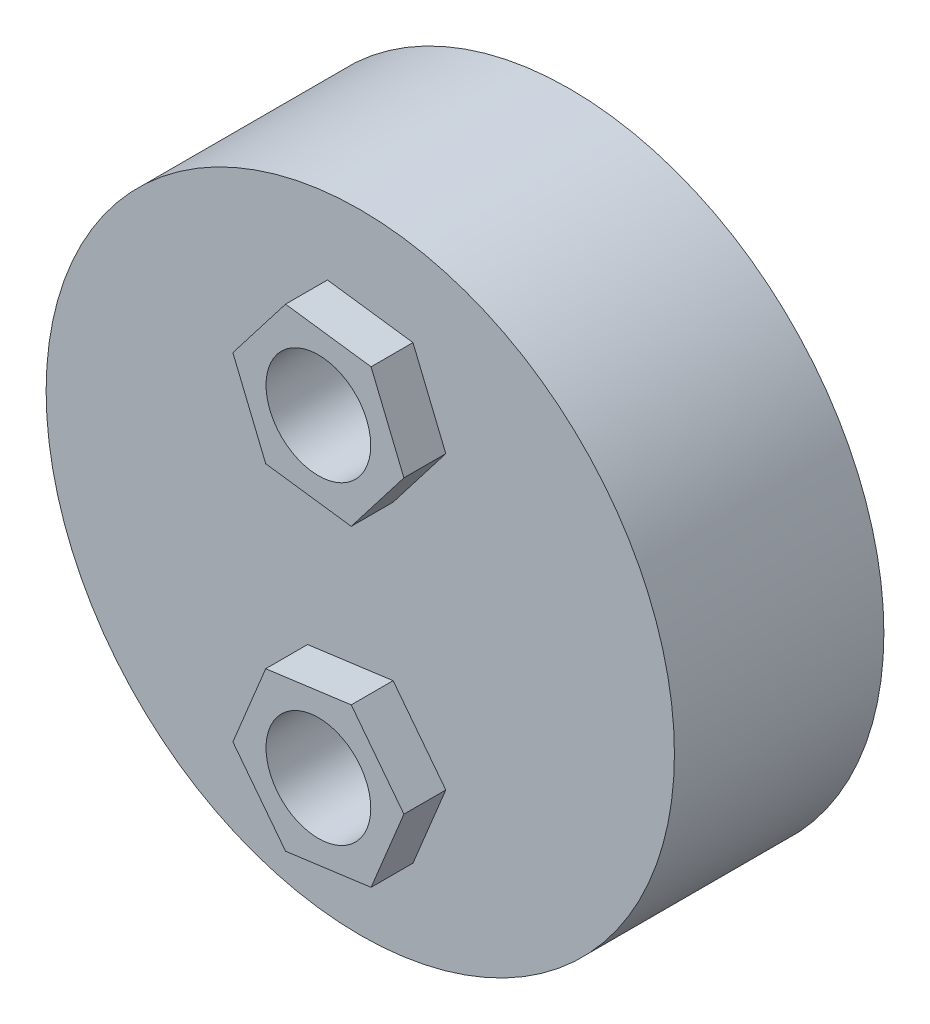
ISO-10303-21;
HEADER;
FILE_DESCRIPTION(('STEP AP214'),'2;1');
FILE_NAME('part.step','',(''),(''),'','','');
FILE_SCHEMA(('AUTOMOTIVE_DESIGN { 1 0 10303 214 1 1 1 1 }'));
ENDSEC;
DATA;
#1=APPLICATION_CONTEXT('core data for automotive mechanical design processes');
#2=APPLICATION_PROTOCOL_DEFINITION('international standard','automotive_design',2000,#1);
#3=PRODUCT_CONTEXT('',#1,'mechanical');
#4=PRODUCT('Part','Part','',(#3));
#5=PRODUCT_RELATED_PRODUCT_CATEGORY('part','',(#4));
#6=PRODUCT_DEFINITION_FORMATION('','',#4);
#7=PRODUCT_DEFINITION_CONTEXT('part definition',#1,'design');
#8=PRODUCT_DEFINITION('design','',#6,#7);
#9=PRODUCT_DEFINITION_SHAPE('','',#8);
#10=(LENGTH_UNIT() NAMED_UNIT(*) SI_UNIT(.MILLI.,.METRE.));
#11=(NAMED_UNIT(*) PLANE_ANGLE_UNIT() SI_UNIT($,.RADIAN.));
#12=(NAMED_UNIT(*) SI_UNIT($,.STERADIAN.) SOLID_ANGLE_UNIT());
#13=UNCERTAINTY_MEASURE_WITH_UNIT(LENGTH_MEASURE(1.E-05),#10,'distance_accuracy_value','');
#14=(GEOMETRIC_REPRESENTATION_CONTEXT(3) GLOBAL_UNCERTAINTY_ASSIGNED_CONTEXT((#13)) GLOBAL_UNIT_ASSIGNED_CONTEXT((#10,
#11,#12)) REPRESENTATION_CONTEXT('',''));
#15=CARTESIAN_POINT('',(0.,0.,0.));
#16=DIRECTION('',(0.,0.,1.));
#17=DIRECTION('',(1.,0.,0.));
#18=AXIS2_PLACEMENT_3D('',#15,#16,#17);
#19=CARTESIAN_POINT('',(0.,0.,10.));
#20=DIRECTION('',(0.,0.,1.));
#21=DIRECTION('',(1.,0.,0.));
#22=AXIS2_PLACEMENT_3D('',#19,#20,#21);
#23=PLANE('',#22);
#24=DIRECTION('',(0.610613766098363,-0.791928550218499,0.));
#25=VECTOR('',#24,1.);
#26=CARTESIAN_POINT('',(-0.80140583409763,-0.617921193012348,10.));
#27=LINE('',#26,#25);
#28=CARTESIAN_POINT('',(1.56758542115873,-3.69035734564447,10.));
#29=VERTEX_POINT('',#28);
#30=CARTESIAN_POINT('',(4.08304002859203,-6.95274747014782,10.));
#31=VERTEX_POINT('',#30);
#32=EDGE_CURVE('E132',#29,#31,#27,.T.);
#33=ORIENTED_EDGE('',*,*,#32,.T.);
#34=DIRECTION('',(-0.380523359422219,-0.924771308450921,0.));
#35=VECTOR('',#34,1.);
#36=CARTESIAN_POINT('',(5.93847545543036,-2.44355400032037,10.));
#37=LINE('',#36,#35);
#38=CARTESIAN_POINT('',(2.5154546074333,-10.7623901245033,10.));
#39=VERTEX_POINT('',#38);
#40=EDGE_CURVE('E148',#31,#39,#37,.T.);
#41=ORIENTED_EDGE('',*,*,#40,.T.);
#42=DIRECTION('',(-0.991137125520582,-0.132842758232422,0.));
#43=VECTOR('',#42,1.);
#44=CARTESIAN_POINT('',(1.4614250146926,-10.9036624013185,10.));
#45=LINE('',#44,#43);
#46=CARTESIAN_POINT('',(-1.56758542115873,-11.3096426543555,10.));
#47=VERTEX_POINT('',#46);
#48=EDGE_CURVE('E171',#39,#47,#45,.T.);
#49=ORIENTED_EDGE('',*,*,#48,.T.);
#50=DIRECTION('',(-0.610613766098363,0.791928550218499,0.));
#51=VECTOR('',#50,1.);
#52=CARTESIAN_POINT('',(-6.45203128384838,-4.97481637722005,10.));
#53=LINE('',#52,#51);
#54=CARTESIAN_POINT('',(-4.08304002859203,-8.04725252985218,10.));
#55=VERTEX_POINT('',#54);
#56=EDGE_CURVE('E169',#47,#55,#53,.T.);
#57=ORIENTED_EDGE('',*,*,#56,.T.);
#58=DIRECTION('',(0.380523359422219,0.924771308450921,0.));
#59=VECTOR('',#58,1.);
#60=CARTESIAN_POINT('',(-0.660019180594972,0.271583594330801,10.));
#61=LINE('',#60,#59);
#62=CARTESIAN_POINT('',(-2.5154546074333,-4.23760987549665,10.));
#63=VERTEX_POINT('',#62);
#64=EDGE_CURVE('E58',#55,#63,#61,.T.);
#65=ORIENTED_EDGE('',*,*,#64,.T.);
#66=DIRECTION('',(0.991137125520582,0.132842758232423,0.));
#67=VECTOR('',#66,1.);
#68=CARTESIAN_POINT('',(0.513555828418029,-3.83162962245958,10.));
#69=LINE('',#68,#67);
#70=EDGE_CURVE('E53',#63,#29,#69,.T.);
#71=ORIENTED_EDGE('',*,*,#70,.T.);
#72=EDGE_LOOP('',(#33,#41,#49,#57,#65,#71));
#73=FACE_BOUND('',#72,.T.);
#74=CARTESIAN_POINT('',(0.,0.,10.));
#75=DIRECTION('',(0.,0.,1.));
#76=DIRECTION('',(1.,0.,0.));
#77=AXIS2_PLACEMENT_3D('',#74,#75,#76);
#78=CIRCLE('',#77,15.);
#79=CARTESIAN_POINT('',(15.,0.,10.));
#80=VERTEX_POINT('',#79);
#81=EDGE_CURVE('E11',#80,#80,#78,.T.);
#82=ORIENTED_EDGE('',*,*,#81,.T.);
#83=EDGE_LOOP('',(#82));
#84=FACE_BOUND('',#83,.T.);
#85=DIRECTION('',(0.991137125520582,-0.132842758232423,0.));
#86=VECTOR('',#85,1.);
#87=CARTESIAN_POINT('',(0.513555828418029,3.83162962245958,10.));
#88=LINE('',#87,#86);
#89=CARTESIAN_POINT('',(-2.5154546074333,4.23760987549665,10.));
#90=VERTEX_POINT('',#89);
#91=CARTESIAN_POINT('',(1.56758542115873,3.69035734564447,10.));
#92=VERTEX_POINT('',#91);
#93=EDGE_CURVE('E205',#90,#92,#88,.T.);
#94=ORIENTED_EDGE('',*,*,#93,.F.);
#95=DIRECTION('',(0.380523359422219,-0.924771308450921,0.));
#96=VECTOR('',#95,1.);
#97=CARTESIAN_POINT('',(-0.660019180594972,-0.271583594330801,10.));
#98=LINE('',#97,#96);
#99=CARTESIAN_POINT('',(-4.08304002859203,8.04725252985218,10.));
#100=VERTEX_POINT('',#99);
#101=EDGE_CURVE('E135',#100,#90,#98,.T.);
#102=ORIENTED_EDGE('',*,*,#101,.F.);
#103=DIRECTION('',(-0.610613766098363,-0.791928550218499,0.));
#104=VECTOR('',#103,1.);
#105=CARTESIAN_POINT('',(-6.45203128384838,4.97481637722005,10.));
#106=LINE('',#105,#104);
#107=CARTESIAN_POINT('',(-1.56758542115873,11.3096426543555,10.));
#108=VERTEX_POINT('',#107);
#109=EDGE_CURVE('E189',#108,#100,#106,.T.);
#110=ORIENTED_EDGE('',*,*,#109,.F.);
#111=DIRECTION('',(-0.991137125520582,0.132842758232422,0.));
#112=VECTOR('',#111,1.);
#113=CARTESIAN_POINT('',(1.4614250146926,10.9036624013185,10.));
#114=LINE('',#113,#112);
#115=CARTESIAN_POINT('',(2.5154546074333,10.7623901245033,10.));
#116=VERTEX_POINT('',#115);
#117=EDGE_CURVE('E211',#116,#108,#114,.T.);
#118=ORIENTED_EDGE('',*,*,#117,.F.);
#119=DIRECTION('',(-0.380523359422219,0.924771308450921,0.));
#120=VECTOR('',#119,1.);
#121=CARTESIAN_POINT('',(5.93847545543036,2.44355400032037,10.));
#122=LINE('',#121,#120);
#123=CARTESIAN_POINT('',(4.08304002859203,6.95274747014782,10.));
#124=VERTEX_POINT('',#123);
#125=EDGE_CURVE('E209',#124,#116,#122,.T.);
#126=ORIENTED_EDGE('',*,*,#125,.F.);
#127=DIRECTION('',(0.610613766098363,0.791928550218499,0.));
#128=VECTOR('',#127,1.);
#129=CARTESIAN_POINT('',(-0.80140583409763,0.617921193012348,10.));
#130=LINE('',#129,#128);
#131=EDGE_CURVE('E207',#92,#124,#130,.T.);
#132=ORIENTED_EDGE('',*,*,#131,.F.);
#133=EDGE_LOOP('',(#94,#102,#110,#118,#126,#132));
#134=FACE_BOUND('',#133,.T.);
#135=ADVANCED_FACE('F38',(#73,#84,#134),#23,.T.);
#136=CARTESIAN_POINT('',(0.,0.,10.));
#137=DIRECTION('',(0.,0.,-1.));
#138=DIRECTION('',(-1.,0.,0.));
#139=AXIS2_PLACEMENT_3D('',#136,#137,#138);
#140=CYLINDRICAL_SURFACE('',#139,15.);
#141=ORIENTED_EDGE('',*,*,#81,.F.);
#142=EDGE_LOOP('',(#141));
#143=FACE_BOUND('',#142,.T.);
#144=CARTESIAN_POINT('',(0.,0.,0.));
#145=DIRECTION('',(0.,0.,1.));
#146=DIRECTION('',(1.,0.,0.));
#147=AXIS2_PLACEMENT_3D('',#144,#145,#146);
#148=CIRCLE('',#147,15.);
#149=CARTESIAN_POINT('',(15.,0.,0.));
#150=VERTEX_POINT('',#149);
#151=EDGE_CURVE('E42',#150,#150,#148,.T.);
#152=ORIENTED_EDGE('',*,*,#151,.T.);
#153=EDGE_LOOP('',(#152));
#154=FACE_BOUND('',#153,.T.);
#155=ADVANCED_FACE('F40',(#143,#154),#140,.T.);
#156=CARTESIAN_POINT('',(0.,0.,0.));
#157=DIRECTION('',(0.,0.,1.));
#158=DIRECTION('',(1.,0.,0.));
#159=AXIS2_PLACEMENT_3D('',#156,#157,#158);
#160=PLANE('',#159);
#161=ORIENTED_EDGE('',*,*,#151,.F.);
#162=EDGE_LOOP('',(#161));
#163=FACE_BOUND('',#162,.T.);
#164=ADVANCED_FACE('F241',(#163),#160,.F.);
#165=CARTESIAN_POINT('',(-0.660019180594972,-0.271583594330801,12.));
#166=DIRECTION('',(0.924771308450921,0.380523359422219,0.));
#167=DIRECTION('',(-0.380523359422219,0.924771308450921,0.));
#168=AXIS2_PLACEMENT_3D('',#165,#166,#167);
#169=PLANE('',#168);
#170=ORIENTED_EDGE('',*,*,#101,.T.);
#171=DIRECTION('',(0.,0.,-1.));
#172=VECTOR('',#171,1.);
#173=CARTESIAN_POINT('',(-2.5154546074333,4.23760987549665,12.));
#174=LINE('',#173,#172);
#175=CARTESIAN_POINT('',(-2.5154546074333,4.23760987549665,12.));
#176=VERTEX_POINT('',#175);
#177=EDGE_CURVE('E228',#176,#90,#174,.T.);
#178=ORIENTED_EDGE('',*,*,#177,.F.);
#179=DIRECTION('',(0.380523359422219,-0.924771308450921,0.));
#180=VECTOR('',#179,1.);
#181=CARTESIAN_POINT('',(-0.660019180594972,-0.271583594330801,12.));
#182=LINE('',#181,#180);
#183=CARTESIAN_POINT('',(-4.08304002859203,8.04725252985218,12.));
#184=VERTEX_POINT('',#183);
#185=EDGE_CURVE('E188',#184,#176,#182,.T.);
#186=ORIENTED_EDGE('',*,*,#185,.F.);
#187=DIRECTION('',(0.,0.,-1.));
#188=VECTOR('',#187,1.);
#189=CARTESIAN_POINT('',(-4.08304002859203,8.04725252985218,12.));
#190=LINE('',#189,#188);
#191=EDGE_CURVE('E202',#184,#100,#190,.T.);
#192=ORIENTED_EDGE('',*,*,#191,.T.);
#193=EDGE_LOOP('',(#170,#178,#186,#192));
#194=FACE_BOUND('',#193,.T.);
#195=ADVANCED_FACE('F243',(#194),#169,.F.);
#196=CARTESIAN_POINT('',(0.513555828418029,3.83162962245958,12.));
#197=DIRECTION('',(0.132842758232423,0.991137125520582,0.));
#198=DIRECTION('',(-0.991137125520582,0.132842758232423,0.));
#199=AXIS2_PLACEMENT_3D('',#196,#197,#198);
#200=PLANE('',#199);
#201=ORIENTED_EDGE('',*,*,#93,.T.);
#202=DIRECTION('',(0.,0.,-1.));
#203=VECTOR('',#202,1.);
#204=CARTESIAN_POINT('',(1.56758542115873,3.69035734564447,12.));
#205=LINE('',#204,#203);
#206=CARTESIAN_POINT('',(1.56758542115873,3.69035734564447,12.));
#207=VERTEX_POINT('',#206);
#208=EDGE_CURVE('E225',#207,#92,#205,.T.);
#209=ORIENTED_EDGE('',*,*,#208,.F.);
#210=DIRECTION('',(0.991137125520582,-0.132842758232423,0.));
#211=VECTOR('',#210,1.);
#212=CARTESIAN_POINT('',(0.513555828418029,3.83162962245958,12.));
#213=LINE('',#212,#211);
#214=EDGE_CURVE('E192',#176,#207,#213,.T.);
#215=ORIENTED_EDGE('',*,*,#214,.F.);
#216=ORIENTED_EDGE('',*,*,#177,.T.);
#217=EDGE_LOOP('',(#201,#209,#215,#216));
#218=FACE_BOUND('',#217,.T.);
#219=ADVANCED_FACE('F248',(#218),#200,.F.);
#220=CARTESIAN_POINT('',(-0.80140583409763,0.617921193012348,12.));
#221=DIRECTION('',(-0.791928550218499,0.610613766098363,0.));
#222=DIRECTION('',(-0.610613766098363,-0.791928550218499,0.));
#223=AXIS2_PLACEMENT_3D('',#220,#221,#222);
#224=PLANE('',#223);
#225=ORIENTED_EDGE('',*,*,#131,.T.);
#226=DIRECTION('',(0.,0.,-1.));
#227=VECTOR('',#226,1.);
#228=CARTESIAN_POINT('',(4.08304002859203,6.95274747014782,12.));
#229=LINE('',#228,#227);
#230=CARTESIAN_POINT('',(4.08304002859203,6.95274747014782,12.));
#231=VERTEX_POINT('',#230);
#232=EDGE_CURVE('E222',#231,#124,#229,.T.);
#233=ORIENTED_EDGE('',*,*,#232,.F.);
#234=DIRECTION('',(0.610613766098363,0.791928550218499,0.));
#235=VECTOR('',#234,1.);
#236=CARTESIAN_POINT('',(-0.80140583409763,0.617921193012348,12.));
#237=LINE('',#236,#235);
#238=EDGE_CURVE('E194',#207,#231,#237,.T.);
#239=ORIENTED_EDGE('',*,*,#238,.F.);
#240=ORIENTED_EDGE('',*,*,#208,.T.);
#241=EDGE_LOOP('',(#225,#233,#239,#240));
#242=FACE_BOUND('',#241,.T.);
#243=ADVANCED_FACE('F276',(#242),#224,.F.);
#244=CARTESIAN_POINT('',(5.93847545543036,2.44355400032037,12.));
#245=DIRECTION('',(-0.924771308450921,-0.380523359422219,0.));
#246=DIRECTION('',(0.380523359422219,-0.924771308450921,0.));
#247=AXIS2_PLACEMENT_3D('',#244,#245,#246);
#248=PLANE('',#247);
#249=ORIENTED_EDGE('',*,*,#125,.T.);
#250=DIRECTION('',(0.,0.,-1.));
#251=VECTOR('',#250,1.);
#252=CARTESIAN_POINT('',(2.5154546074333,10.7623901245033,12.));
#253=LINE('',#252,#251);
#254=CARTESIAN_POINT('',(2.5154546074333,10.7623901245033,12.));
#255=VERTEX_POINT('',#254);
#256=EDGE_CURVE('E219',#255,#116,#253,.T.);
#257=ORIENTED_EDGE('',*,*,#256,.F.);
#258=DIRECTION('',(-0.380523359422219,0.924771308450921,0.));
#259=VECTOR('',#258,1.);
#260=CARTESIAN_POINT('',(5.93847545543036,2.44355400032037,12.));
#261=LINE('',#260,#259);
#262=EDGE_CURVE('E196',#231,#255,#261,.T.);
#263=ORIENTED_EDGE('',*,*,#262,.F.);
#264=ORIENTED_EDGE('',*,*,#232,.T.);
#265=EDGE_LOOP('',(#249,#257,#263,#264));
#266=FACE_BOUND('',#265,.T.);
#267=ADVANCED_FACE('F280',(#266),#248,.F.);
#268=CARTESIAN_POINT('',(1.4614250146926,10.9036624013185,12.));
#269=DIRECTION('',(-0.132842758232422,-0.991137125520582,0.));
#270=DIRECTION('',(0.991137125520582,-0.132842758232422,0.));
#271=AXIS2_PLACEMENT_3D('',#268,#269,#270);
#272=PLANE('',#271);
#273=ORIENTED_EDGE('',*,*,#117,.T.);
#274=DIRECTION('',(0.,0.,-1.));
#275=VECTOR('',#274,1.);
#276=CARTESIAN_POINT('',(-1.56758542115872,11.3096426543555,12.));
#277=LINE('',#276,#275);
#278=CARTESIAN_POINT('',(-1.56758542115872,11.3096426543555,12.));
#279=VERTEX_POINT('',#278);
#280=EDGE_CURVE('E217',#279,#108,#277,.T.);
#281=ORIENTED_EDGE('',*,*,#280,.F.);
#282=DIRECTION('',(-0.991137125520582,0.132842758232422,0.));
#283=VECTOR('',#282,1.);
#284=CARTESIAN_POINT('',(1.4614250146926,10.9036624013185,12.));
#285=LINE('',#284,#283);
#286=EDGE_CURVE('E198',#255,#279,#285,.T.);
#287=ORIENTED_EDGE('',*,*,#286,.F.);
#288=ORIENTED_EDGE('',*,*,#256,.T.);
#289=EDGE_LOOP('',(#273,#281,#287,#288));
#290=FACE_BOUND('',#289,.T.);
#291=ADVANCED_FACE('F284',(#290),#272,.F.);
#292=CARTESIAN_POINT('',(-6.45203128384838,4.97481637722005,12.));
#293=DIRECTION('',(0.791928550218499,-0.610613766098363,0.));
#294=DIRECTION('',(0.610613766098363,0.791928550218499,0.));
#295=AXIS2_PLACEMENT_3D('',#292,#293,#294);
#296=PLANE('',#295);
#297=ORIENTED_EDGE('',*,*,#109,.T.);
#298=ORIENTED_EDGE('',*,*,#191,.F.);
#299=DIRECTION('',(-0.610613766098363,-0.791928550218499,0.));
#300=VECTOR('',#299,1.);
#301=CARTESIAN_POINT('',(-6.45203128384838,4.97481637722005,12.));
#302=LINE('',#301,#300);
#303=EDGE_CURVE('E200',#279,#184,#302,.T.);
#304=ORIENTED_EDGE('',*,*,#303,.F.);
#305=ORIENTED_EDGE('',*,*,#280,.T.);
#306=EDGE_LOOP('',(#297,#298,#304,#305));
#307=FACE_BOUND('',#306,.T.);
#308=ADVANCED_FACE('F288',(#307),#296,.F.);
#309=CARTESIAN_POINT('',(0.,0.,12.));
#310=DIRECTION('',(0.,0.,1.));
#311=DIRECTION('',(1.,0.,0.));
#312=AXIS2_PLACEMENT_3D('',#309,#310,#311);
#313=PLANE('',#312);
#314=CARTESIAN_POINT('',(0.,7.5,12.));
#315=DIRECTION('',(0.,0.,1.));
#316=DIRECTION('',(1.,0.,0.));
#317=AXIS2_PLACEMENT_3D('',#314,#315,#316);
#318=CIRCLE('',#317,2.5);
#319=CARTESIAN_POINT('',(2.5,7.5,12.));
#320=VERTEX_POINT('',#319);
#321=EDGE_CURVE('E185',#320,#320,#318,.F.);
#322=ORIENTED_EDGE('',*,*,#321,.T.);
#323=EDGE_LOOP('',(#322));
#324=FACE_BOUND('',#323,.T.);
#325=ORIENTED_EDGE('',*,*,#185,.T.);
#326=ORIENTED_EDGE('',*,*,#214,.T.);
#327=ORIENTED_EDGE('',*,*,#238,.T.);
#328=ORIENTED_EDGE('',*,*,#262,.T.);
#329=ORIENTED_EDGE('',*,*,#286,.T.);
#330=ORIENTED_EDGE('',*,*,#303,.T.);
#331=EDGE_LOOP('',(#325,#326,#327,#328,#329,#330));
#332=FACE_BOUND('',#331,.T.);
#333=ADVANCED_FACE('F265',(#324,#332),#313,.T.);
#334=CARTESIAN_POINT('',(0.,0.,5.));
#335=DIRECTION('',(0.,0.,1.));
#336=DIRECTION('',(1.,0.,0.));
#337=AXIS2_PLACEMENT_3D('',#334,#335,#336);
#338=PLANE('',#337);
#339=CARTESIAN_POINT('',(0.,7.5,5.));
#340=DIRECTION('',(0.,0.,1.));
#341=DIRECTION('',(1.,0.,0.));
#342=AXIS2_PLACEMENT_3D('',#339,#340,#341);
#343=CIRCLE('',#342,2.5);
#344=CARTESIAN_POINT('',(2.5,7.5,5.));
#345=VERTEX_POINT('',#344);
#346=EDGE_CURVE('E233',#345,#345,#343,.T.);
#347=ORIENTED_EDGE('',*,*,#346,.T.);
#348=EDGE_LOOP('',(#347));
#349=FACE_BOUND('',#348,.T.);
#350=ADVANCED_FACE('F261',(#349),#338,.T.);
#351=CARTESIAN_POINT('',(0.,7.5,5.));
#352=DIRECTION('',(0.,0.,1.));
#353=DIRECTION('',(1.,0.,0.));
#354=AXIS2_PLACEMENT_3D('',#351,#352,#353);
#355=CYLINDRICAL_SURFACE('',#354,2.5);
#356=ORIENTED_EDGE('',*,*,#346,.F.);
#357=EDGE_LOOP('',(#356));
#358=FACE_BOUND('',#357,.T.);
#359=ORIENTED_EDGE('',*,*,#321,.F.);
#360=EDGE_LOOP('',(#359));
#361=FACE_BOUND('',#360,.T.);
#362=ADVANCED_FACE('F258',(#358,#361),#355,.F.);
#363=CARTESIAN_POINT('',(-0.80140583409763,-0.617921193012348,12.));
#364=DIRECTION('',(0.791928550218499,0.610613766098363,0.));
#365=DIRECTION('',(-0.610613766098363,0.791928550218499,0.));
#366=AXIS2_PLACEMENT_3D('',#363,#364,#365);
#367=PLANE('',#366);
#368=ORIENTED_EDGE('',*,*,#32,.F.);
#369=DIRECTION('',(0.,0.,-1.));
#370=VECTOR('',#369,1.);
#371=CARTESIAN_POINT('',(1.56758542115873,-3.69035734564447,12.));
#372=LINE('',#371,#370);
#373=CARTESIAN_POINT('',(1.56758542115873,-3.69035734564447,12.));
#374=VERTEX_POINT('',#373);
#375=EDGE_CURVE('E126',#374,#29,#372,.T.);
#376=ORIENTED_EDGE('',*,*,#375,.F.);
#377=DIRECTION('',(0.610613766098363,-0.791928550218499,0.));
#378=VECTOR('',#377,1.);
#379=CARTESIAN_POINT('',(-0.80140583409763,-0.617921193012348,12.));
#380=LINE('',#379,#378);
#381=CARTESIAN_POINT('',(4.08304002859203,-6.95274747014782,12.));
#382=VERTEX_POINT('',#381);
#383=EDGE_CURVE('E130',#374,#382,#380,.T.);
#384=ORIENTED_EDGE('',*,*,#383,.T.);
#385=DIRECTION('',(0.,0.,-1.));
#386=VECTOR('',#385,1.);
#387=CARTESIAN_POINT('',(4.08304002859203,-6.95274747014782,12.));
#388=LINE('',#387,#386);
#389=EDGE_CURVE('E165',#382,#31,#388,.T.);
#390=ORIENTED_EDGE('',*,*,#389,.T.);
#391=EDGE_LOOP('',(#368,#376,#384,#390));
#392=FACE_BOUND('',#391,.T.);
#393=ADVANCED_FACE('F128',(#392),#367,.T.);
#394=CARTESIAN_POINT('',(0.513555828418029,-3.83162962245958,12.));
#395=DIRECTION('',(-0.132842758232423,0.991137125520582,0.));
#396=DIRECTION('',(-0.991137125520582,-0.132842758232423,0.));
#397=AXIS2_PLACEMENT_3D('',#394,#395,#396);
#398=PLANE('',#397);
#399=ORIENTED_EDGE('',*,*,#70,.F.);
#400=DIRECTION('',(0.,0.,-1.));
#401=VECTOR('',#400,1.);
#402=CARTESIAN_POINT('',(-2.5154546074333,-4.23760987549665,12.));
#403=LINE('',#402,#401);
#404=CARTESIAN_POINT('',(-2.5154546074333,-4.23760987549665,12.));
#405=VERTEX_POINT('',#404);
#406=EDGE_CURVE('E136',#405,#63,#403,.T.);
#407=ORIENTED_EDGE('',*,*,#406,.F.);
#408=DIRECTION('',(0.991137125520582,0.132842758232423,0.));
#409=VECTOR('',#408,1.);
#410=CARTESIAN_POINT('',(0.513555828418029,-3.83162962245958,12.));
#411=LINE('',#410,#409);
#412=EDGE_CURVE('E143',#405,#374,#411,.T.);
#413=ORIENTED_EDGE('',*,*,#412,.T.);
#414=ORIENTED_EDGE('',*,*,#375,.T.);
#415=EDGE_LOOP('',(#399,#407,#413,#414));
#416=FACE_BOUND('',#415,.T.);
#417=ADVANCED_FACE('F150',(#416),#398,.T.);
#418=CARTESIAN_POINT('',(-0.660019180594972,0.271583594330801,12.));
#419=DIRECTION('',(-0.924771308450921,0.380523359422219,0.));
#420=DIRECTION('',(-0.380523359422219,-0.924771308450921,0.));
#421=AXIS2_PLACEMENT_3D('',#418,#419,#420);
#422=PLANE('',#421);
#423=ORIENTED_EDGE('',*,*,#64,.F.);
#424=DIRECTION('',(0.,0.,-1.));
#425=VECTOR('',#424,1.);
#426=CARTESIAN_POINT('',(-4.08304002859203,-8.04725252985218,12.));
#427=LINE('',#426,#425);
#428=CARTESIAN_POINT('',(-4.08304002859203,-8.04725252985218,12.));
#429=VERTEX_POINT('',#428);
#430=EDGE_CURVE('E181',#429,#55,#427,.T.);
#431=ORIENTED_EDGE('',*,*,#430,.F.);
#432=DIRECTION('',(0.380523359422219,0.924771308450921,0.));
#433=VECTOR('',#432,1.);
#434=CARTESIAN_POINT('',(-0.660019180594972,0.271583594330801,12.));
#435=LINE('',#434,#433);
#436=EDGE_CURVE('E151',#429,#405,#435,.T.);
#437=ORIENTED_EDGE('',*,*,#436,.T.);
#438=ORIENTED_EDGE('',*,*,#406,.T.);
#439=EDGE_LOOP('',(#423,#431,#437,#438));
#440=FACE_BOUND('',#439,.T.);
#441=ADVANCED_FACE('F300',(#440),#422,.T.);
#442=CARTESIAN_POINT('',(-6.45203128384838,-4.97481637722005,12.));
#443=DIRECTION('',(-0.791928550218499,-0.610613766098363,0.));
#444=DIRECTION('',(0.610613766098363,-0.791928550218499,0.));
#445=AXIS2_PLACEMENT_3D('',#442,#443,#444);
#446=PLANE('',#445);
#447=ORIENTED_EDGE('',*,*,#56,.F.);
#448=DIRECTION('',(0.,0.,-1.));
#449=VECTOR('',#448,1.);
#450=CARTESIAN_POINT('',(-1.56758542115873,-11.3096426543555,12.));
#451=LINE('',#450,#449);
#452=CARTESIAN_POINT('',(-1.56758542115873,-11.3096426543555,12.));
#453=VERTEX_POINT('',#452);
#454=EDGE_CURVE('E178',#453,#47,#451,.T.);
#455=ORIENTED_EDGE('',*,*,#454,.F.);
#456=DIRECTION('',(-0.610613766098363,0.791928550218499,0.));
#457=VECTOR('',#456,1.);
#458=CARTESIAN_POINT('',(-6.45203128384838,-4.97481637722005,12.));
#459=LINE('',#458,#457);
#460=EDGE_CURVE('E153',#453,#429,#459,.T.);
#461=ORIENTED_EDGE('',*,*,#460,.T.);
#462=ORIENTED_EDGE('',*,*,#430,.T.);
#463=EDGE_LOOP('',(#447,#455,#461,#462));
#464=FACE_BOUND('',#463,.T.);
#465=ADVANCED_FACE('F303',(#464),#446,.T.);
#466=CARTESIAN_POINT('',(1.4614250146926,-10.9036624013185,12.));
#467=DIRECTION('',(0.132842758232422,-0.991137125520582,0.));
#468=DIRECTION('',(0.991137125520582,0.132842758232422,0.));
#469=AXIS2_PLACEMENT_3D('',#466,#467,#468);
#470=PLANE('',#469);
#471=ORIENTED_EDGE('',*,*,#48,.F.);
#472=DIRECTION('',(0.,0.,-1.));
#473=VECTOR('',#472,1.);
#474=CARTESIAN_POINT('',(2.5154546074333,-10.7623901245033,12.));
#475=LINE('',#474,#473);
#476=CARTESIAN_POINT('',(2.5154546074333,-10.7623901245033,12.));
#477=VERTEX_POINT('',#476);
#478=EDGE_CURVE('E175',#477,#39,#475,.T.);
#479=ORIENTED_EDGE('',*,*,#478,.F.);
#480=DIRECTION('',(-0.991137125520582,-0.132842758232422,0.));
#481=VECTOR('',#480,1.);
#482=CARTESIAN_POINT('',(1.4614250146926,-10.9036624013185,12.));
#483=LINE('',#482,#481);
#484=EDGE_CURVE('E158',#477,#453,#483,.T.);
#485=ORIENTED_EDGE('',*,*,#484,.T.);
#486=ORIENTED_EDGE('',*,*,#454,.T.);
#487=EDGE_LOOP('',(#471,#479,#485,#486));
#488=FACE_BOUND('',#487,.T.);
#489=ADVANCED_FACE('F307',(#488),#470,.T.);
#490=CARTESIAN_POINT('',(5.93847545543036,-2.44355400032037,12.));
#491=DIRECTION('',(0.924771308450921,-0.380523359422219,0.));
#492=DIRECTION('',(0.380523359422219,0.924771308450921,0.));
#493=AXIS2_PLACEMENT_3D('',#490,#491,#492);
#494=PLANE('',#493);
#495=ORIENTED_EDGE('',*,*,#40,.F.);
#496=ORIENTED_EDGE('',*,*,#389,.F.);
#497=DIRECTION('',(-0.380523359422219,-0.924771308450921,0.));
#498=VECTOR('',#497,1.);
#499=CARTESIAN_POINT('',(5.93847545543036,-2.44355400032037,12.));
#500=LINE('',#499,#498);
#501=EDGE_CURVE('E147',#382,#477,#500,.T.);
#502=ORIENTED_EDGE('',*,*,#501,.T.);
#503=ORIENTED_EDGE('',*,*,#478,.T.);
#504=EDGE_LOOP('',(#495,#496,#502,#503));
#505=FACE_BOUND('',#504,.T.);
#506=ADVANCED_FACE('F311',(#505),#494,.T.);
#507=CARTESIAN_POINT('',(0.,0.,12.));
#508=DIRECTION('',(0.,0.,1.));
#509=DIRECTION('',(1.,0.,0.));
#510=AXIS2_PLACEMENT_3D('',#507,#508,#509);
#511=PLANE('',#510);
#512=ORIENTED_EDGE('',*,*,#383,.F.);
#513=ORIENTED_EDGE('',*,*,#412,.F.);
#514=ORIENTED_EDGE('',*,*,#436,.F.);
#515=ORIENTED_EDGE('',*,*,#460,.F.);
#516=ORIENTED_EDGE('',*,*,#484,.F.);
#517=ORIENTED_EDGE('',*,*,#501,.F.);
#518=EDGE_LOOP('',(#512,#513,#514,#515,#516,#517));
#519=FACE_BOUND('',#518,.T.);
#520=CARTESIAN_POINT('',(0.,-7.5,12.));
#521=DIRECTION('',(0.,0.,1.));
#522=DIRECTION('',(1.,0.,0.));
#523=AXIS2_PLACEMENT_3D('',#520,#521,#522);
#524=CIRCLE('',#523,2.5);
#525=CARTESIAN_POINT('',(2.5,-7.5,12.));
#526=VERTEX_POINT('',#525);
#527=EDGE_CURVE('E162',#526,#526,#524,.F.);
#528=ORIENTED_EDGE('',*,*,#527,.T.);
#529=EDGE_LOOP('',(#528));
#530=FACE_BOUND('',#529,.T.);
#531=ADVANCED_FACE('F140',(#519,#530),#511,.T.);
#532=CARTESIAN_POINT('',(0.,0.,5.));
#533=DIRECTION('',(0.,0.,1.));
#534=DIRECTION('',(1.,0.,0.));
#535=AXIS2_PLACEMENT_3D('',#532,#533,#534);
#536=PLANE('',#535);
#537=CARTESIAN_POINT('',(0.,-7.5,5.));
#538=DIRECTION('',(0.,0.,1.));
#539=DIRECTION('',(1.,0.,0.));
#540=AXIS2_PLACEMENT_3D('',#537,#538,#539);
#541=CIRCLE('',#540,2.5);
#542=CARTESIAN_POINT('',(2.5,-7.5,5.));
#543=VERTEX_POINT('',#542);
#544=EDGE_CURVE('E230',#543,#543,#541,.F.);
#545=ORIENTED_EDGE('',*,*,#544,.F.);
#546=EDGE_LOOP('',(#545));
#547=FACE_BOUND('',#546,.T.);
#548=ADVANCED_FACE('F269',(#547),#536,.T.);
#549=CARTESIAN_POINT('',(0.,-7.5,5.));
#550=DIRECTION('',(0.,0.,1.));
#551=DIRECTION('',(1.,0.,0.));
#552=AXIS2_PLACEMENT_3D('',#549,#550,#551);
#553=CYLINDRICAL_SURFACE('',#552,2.5);
#554=ORIENTED_EDGE('',*,*,#544,.T.);
#555=EDGE_LOOP('',(#554));
#556=FACE_BOUND('',#555,.T.);
#557=ORIENTED_EDGE('',*,*,#527,.F.);
#558=EDGE_LOOP('',(#557));
#559=FACE_BOUND('',#558,.T.);
#560=ADVANCED_FACE('F266',(#556,#559),#553,.F.);
#561=CLOSED_SHELL('',(#135,#155,#164,#195,#219,#243,#267,#291,#308,#333,#350,#362,#393,#417,
#441,#465,#489,#506,#531,#548,#560));
#562=MANIFOLD_SOLID_BREP('B2',#561);
#563=ADVANCED_BREP_SHAPE_REPRESENTATION('',(#18,#562),#14);
#564=SHAPE_DEFINITION_REPRESENTATION(#9,#563);
ENDSEC;
END-ISO-10303-21;
